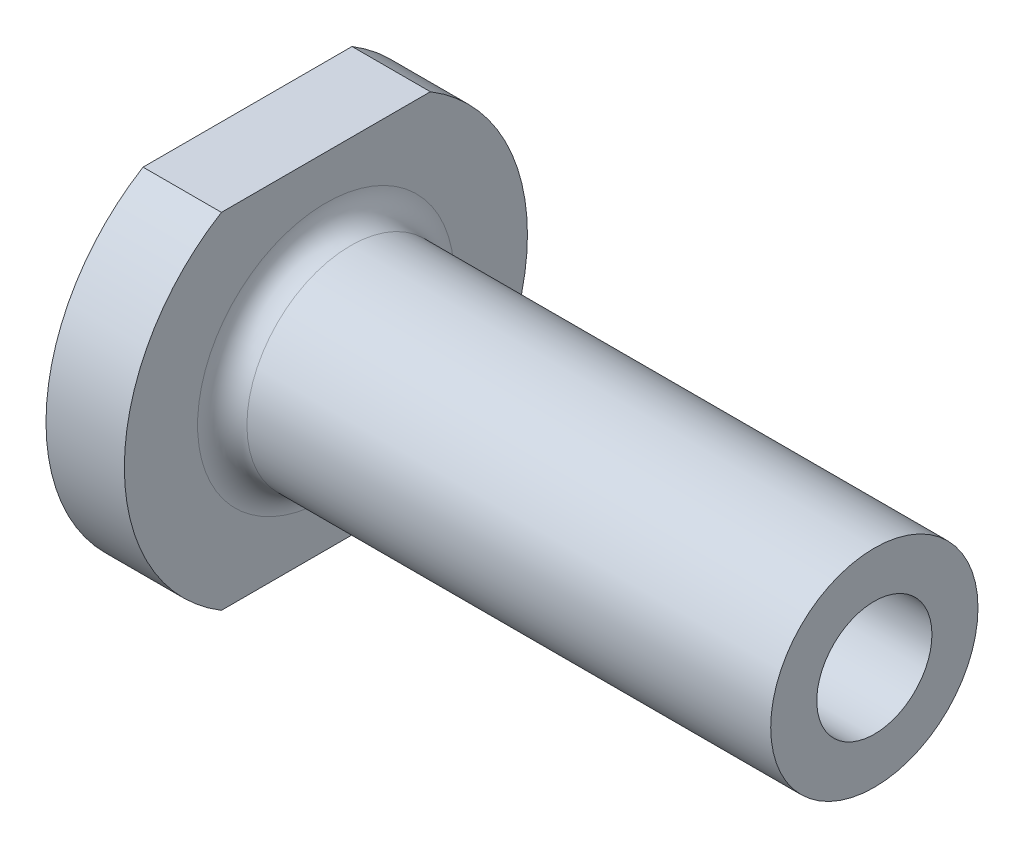
ISO-10303-21;
HEADER;
FILE_DESCRIPTION(('STEP AP214'),'2;1');
FILE_NAME('part.step','',(''),(''),'','','');
FILE_SCHEMA(('AUTOMOTIVE_DESIGN { 1 0 10303 214 1 1 1 1 }'));
ENDSEC;
DATA;
#1=APPLICATION_CONTEXT('core data for automotive mechanical design processes');
#2=APPLICATION_PROTOCOL_DEFINITION('international standard','automotive_design',2000,#1);
#3=PRODUCT_CONTEXT('',#1,'mechanical');
#4=PRODUCT('Part','Part','',(#3));
#5=PRODUCT_RELATED_PRODUCT_CATEGORY('part','',(#4));
#6=PRODUCT_DEFINITION_FORMATION('','',#4);
#7=PRODUCT_DEFINITION_CONTEXT('part definition',#1,'design');
#8=PRODUCT_DEFINITION('design','',#6,#7);
#9=PRODUCT_DEFINITION_SHAPE('','',#8);
#10=(LENGTH_UNIT() NAMED_UNIT(*) SI_UNIT(.MILLI.,.METRE.));
#11=(NAMED_UNIT(*) PLANE_ANGLE_UNIT() SI_UNIT($,.RADIAN.));
#12=(NAMED_UNIT(*) SI_UNIT($,.STERADIAN.) SOLID_ANGLE_UNIT());
#13=UNCERTAINTY_MEASURE_WITH_UNIT(LENGTH_MEASURE(1.E-05),#10,'distance_accuracy_value','');
#14=(GEOMETRIC_REPRESENTATION_CONTEXT(3) GLOBAL_UNCERTAINTY_ASSIGNED_CONTEXT((#13)) GLOBAL_UNIT_ASSIGNED_CONTEXT((#10,
#11,#12)) REPRESENTATION_CONTEXT('',''));
#15=CARTESIAN_POINT('',(0.,0.,0.));
#16=DIRECTION('',(0.,0.,1.));
#17=DIRECTION('',(1.,0.,0.));
#18=AXIS2_PLACEMENT_3D('',#15,#16,#17);
#19=CARTESIAN_POINT('',(0.,0.,0.));
#20=DIRECTION('',(1.,0.,0.));
#21=DIRECTION('',(0.,0.,-1.));
#22=AXIS2_PLACEMENT_3D('',#19,#20,#21);
#23=CYLINDRICAL_SURFACE('',#22,12.250000011);
#24=DIRECTION('',(1.,0.,0.));
#25=VECTOR('',#24,1.);
#26=CARTESIAN_POINT('',(0.,10.4756861479094,-6.35));
#27=LINE('',#26,#25);
#28=CARTESIAN_POINT('',(4.76250000000002,10.4756861479094,-6.35));
#29=VERTEX_POINT('',#28);
#30=CARTESIAN_POINT('',(0.,10.4756861479094,-6.35));
#31=VERTEX_POINT('',#30);
#32=EDGE_CURVE('E11',#29,#31,#27,.F.);
#33=ORIENTED_EDGE('',*,*,#32,.F.);
#34=CARTESIAN_POINT('',(4.7625,0.,0.));
#35=DIRECTION('',(1.,0.,0.));
#36=DIRECTION('',(0.,0.,-1.));
#37=AXIS2_PLACEMENT_3D('',#34,#35,#36);
#38=CIRCLE('',#37,12.250000011);
#39=CARTESIAN_POINT('',(4.76250000000002,-10.4756861479094,-6.35));
#40=VERTEX_POINT('',#39);
#41=EDGE_CURVE('E118',#40,#29,#38,.T.);
#42=ORIENTED_EDGE('',*,*,#41,.F.);
#43=DIRECTION('',(1.,0.,0.));
#44=VECTOR('',#43,1.);
#45=CARTESIAN_POINT('',(0.,-10.4756861479094,-6.35));
#46=LINE('',#45,#44);
#47=CARTESIAN_POINT('',(0.,-10.4756861479094,-6.35));
#48=VERTEX_POINT('',#47);
#49=EDGE_CURVE('E110',#48,#40,#46,.T.);
#50=ORIENTED_EDGE('',*,*,#49,.F.);
#51=CARTESIAN_POINT('',(0.,0.,0.));
#52=DIRECTION('',(1.,0.,0.));
#53=DIRECTION('',(0.,0.,-1.));
#54=AXIS2_PLACEMENT_3D('',#51,#52,#53);
#55=CIRCLE('',#54,12.250000011);
#56=EDGE_CURVE('E104',#48,#31,#55,.T.);
#57=ORIENTED_EDGE('',*,*,#56,.T.);
#58=EDGE_LOOP('',(#33,#42,#50,#57));
#59=FACE_BOUND('',#58,.T.);
#60=ADVANCED_FACE('F53',(#59),#23,.T.);
#61=CARTESIAN_POINT('',(0.,12.250000011,0.));
#62=DIRECTION('',(-1.,0.,0.));
#63=DIRECTION('',(0.,0.,1.));
#64=AXIS2_PLACEMENT_3D('',#61,#62,#63);
#65=PLANE('',#64);
#66=DIRECTION('',(0.,0.,1.));
#67=VECTOR('',#66,1.);
#68=CARTESIAN_POINT('',(0.,10.4756861479094,-6.35));
#69=LINE('',#68,#67);
#70=CARTESIAN_POINT('',(0.,10.4756861479094,6.35));
#71=VERTEX_POINT('',#70);
#72=EDGE_CURVE('E76',#31,#71,#69,.T.);
#73=ORIENTED_EDGE('',*,*,#72,.F.);
#74=ORIENTED_EDGE('',*,*,#56,.F.);
#75=DIRECTION('',(0.,0.,-1.));
#76=VECTOR('',#75,1.);
#77=CARTESIAN_POINT('',(0.,-10.4756861479094,6.35));
#78=LINE('',#77,#76);
#79=CARTESIAN_POINT('',(0.,-10.4756861479094,6.35));
#80=VERTEX_POINT('',#79);
#81=EDGE_CURVE('E69',#80,#48,#78,.T.);
#82=ORIENTED_EDGE('',*,*,#81,.F.);
#83=EDGE_CURVE('E106',#71,#80,#55,.T.);
#84=ORIENTED_EDGE('',*,*,#83,.F.);
#85=EDGE_LOOP('',(#73,#74,#82,#84));
#86=FACE_BOUND('',#85,.T.);
#87=CARTESIAN_POINT('',(0.,0.,0.));
#88=DIRECTION('',(1.,0.,0.));
#89=DIRECTION('',(0.,0.,-1.));
#90=AXIS2_PLACEMENT_3D('',#87,#88,#89);
#91=CIRCLE('',#90,3.49999999999999);
#92=CARTESIAN_POINT('',(0.,0.,-3.49999999999999));
#93=VERTEX_POINT('',#92);
#94=EDGE_CURVE('E112',#93,#93,#91,.T.);
#95=ORIENTED_EDGE('',*,*,#94,.T.);
#96=EDGE_LOOP('',(#95));
#97=FACE_BOUND('',#96,.T.);
#98=ADVANCED_FACE('F102',(#86,#97),#65,.T.);
#99=CARTESIAN_POINT('',(38.1,0.,0.));
#100=DIRECTION('',(1.,0.,0.));
#101=DIRECTION('',(0.,0.,-1.));
#102=AXIS2_PLACEMENT_3D('',#99,#100,#101);
#103=PLANE('',#102);
#104=CARTESIAN_POINT('',(38.1,0.,0.));
#105=DIRECTION('',(1.,0.,0.));
#106=DIRECTION('',(0.,0.,-1.));
#107=AXIS2_PLACEMENT_3D('',#104,#105,#106);
#108=CIRCLE('',#107,3.5);
#109=CARTESIAN_POINT('',(38.1,0.,-3.5));
#110=VERTEX_POINT('',#109);
#111=EDGE_CURVE('E120',#110,#110,#108,.T.);
#112=ORIENTED_EDGE('',*,*,#111,.F.);
#113=EDGE_LOOP('',(#112));
#114=FACE_BOUND('',#113,.T.);
#115=CARTESIAN_POINT('',(38.1,0.,0.));
#116=DIRECTION('',(1.,0.,0.));
#117=DIRECTION('',(0.,0.,-1.));
#118=AXIS2_PLACEMENT_3D('',#115,#116,#117);
#119=CIRCLE('',#118,6.299999973);
#120=CARTESIAN_POINT('',(38.1,0.,-6.299999973));
#121=VERTEX_POINT('',#120);
#122=EDGE_CURVE('E127',#121,#121,#119,.T.);
#123=ORIENTED_EDGE('',*,*,#122,.T.);
#124=EDGE_LOOP('',(#123));
#125=FACE_BOUND('',#124,.T.);
#126=ADVANCED_FACE('F209',(#114,#125),#103,.T.);
#127=CARTESIAN_POINT('',(0.,0.,0.));
#128=DIRECTION('',(1.,0.,0.));
#129=DIRECTION('',(0.,0.,-1.));
#130=AXIS2_PLACEMENT_3D('',#127,#128,#129);
#131=CYLINDRICAL_SURFACE('',#130,6.299999973);
#132=CARTESIAN_POINT('',(6.2625,0.,0.));
#133=DIRECTION('',(1.,0.,0.));
#134=DIRECTION('',(0.,0.,-1.));
#135=AXIS2_PLACEMENT_3D('',#132,#133,#134);
#136=CIRCLE('',#135,6.299999973);
#137=CARTESIAN_POINT('',(6.2625,0.,-6.299999973));
#138=VERTEX_POINT('',#137);
#139=EDGE_CURVE('E131',#138,#138,#136,.T.);
#140=ORIENTED_EDGE('',*,*,#139,.T.);
#141=EDGE_LOOP('',(#140));
#142=FACE_BOUND('',#141,.T.);
#143=ORIENTED_EDGE('',*,*,#122,.F.);
#144=EDGE_LOOP('',(#143));
#145=FACE_BOUND('',#144,.T.);
#146=ADVANCED_FACE('F216',(#142,#145),#131,.T.);
#147=CARTESIAN_POINT('',(4.7625,6.299999973,0.));
#148=DIRECTION('',(1.,0.,0.));
#149=DIRECTION('',(0.,0.,-1.));
#150=AXIS2_PLACEMENT_3D('',#147,#148,#149);
#151=PLANE('',#150);
#152=DIRECTION('',(0.,0.,-1.));
#153=VECTOR('',#152,1.);
#154=CARTESIAN_POINT('',(4.7625,10.4756861479094,0.));
#155=LINE('',#154,#153);
#156=CARTESIAN_POINT('',(4.76250000000002,10.4756861479094,6.35));
#157=VERTEX_POINT('',#156);
#158=EDGE_CURVE('E94',#157,#29,#155,.T.);
#159=ORIENTED_EDGE('',*,*,#158,.F.);
#160=CARTESIAN_POINT('',(4.76250000000002,-10.4756861479094,6.35));
#161=VERTEX_POINT('',#160);
#162=EDGE_CURVE('E126',#157,#161,#38,.T.);
#163=ORIENTED_EDGE('',*,*,#162,.T.);
#164=DIRECTION('',(0.,0.,1.));
#165=VECTOR('',#164,1.);
#166=CARTESIAN_POINT('',(4.7625,-10.4756861479094,0.));
#167=LINE('',#166,#165);
#168=EDGE_CURVE('E108',#40,#161,#167,.T.);
#169=ORIENTED_EDGE('',*,*,#168,.F.);
#170=ORIENTED_EDGE('',*,*,#41,.T.);
#171=EDGE_LOOP('',(#159,#163,#169,#170));
#172=FACE_BOUND('',#171,.T.);
#173=CARTESIAN_POINT('',(4.7625,0.,0.));
#174=DIRECTION('',(1.,0.,0.));
#175=DIRECTION('',(0.,0.,-1.));
#176=AXIS2_PLACEMENT_3D('',#173,#174,#175);
#177=CIRCLE('',#176,7.799999973);
#178=CARTESIAN_POINT('',(4.7625,0.,-7.799999973));
#179=VERTEX_POINT('',#178);
#180=EDGE_CURVE('E135',#179,#179,#177,.F.);
#181=ORIENTED_EDGE('',*,*,#180,.T.);
#182=EDGE_LOOP('',(#181));
#183=FACE_BOUND('',#182,.T.);
#184=ADVANCED_FACE('F150',(#172,#183),#151,.T.);
#185=DIRECTION('',(1.,0.,0.));
#186=VECTOR('',#185,1.);
#187=CARTESIAN_POINT('',(0.,10.4756861479094,6.35));
#188=LINE('',#187,#186);
#189=EDGE_CURVE('E62',#71,#157,#188,.T.);
#190=ORIENTED_EDGE('',*,*,#189,.F.);
#191=ORIENTED_EDGE('',*,*,#83,.T.);
#192=DIRECTION('',(1.,0.,0.));
#193=VECTOR('',#192,1.);
#194=CARTESIAN_POINT('',(0.,-10.4756861479094,6.35));
#195=LINE('',#194,#193);
#196=EDGE_CURVE('E141',#161,#80,#195,.F.);
#197=ORIENTED_EDGE('',*,*,#196,.F.);
#198=ORIENTED_EDGE('',*,*,#162,.F.);
#199=EDGE_LOOP('',(#190,#191,#197,#198));
#200=FACE_BOUND('',#199,.T.);
#201=ADVANCED_FACE('F156',(#200),#23,.T.);
#202=CARTESIAN_POINT('',(6.2625,0.,0.));
#203=DIRECTION('',(1.,0.,0.));
#204=DIRECTION('',(0.,0.,-1.));
#205=AXIS2_PLACEMENT_3D('',#202,#203,#204);
#206=TOROIDAL_SURFACE('',#205,7.799999973,1.5);
#207=ORIENTED_EDGE('',*,*,#180,.F.);
#208=EDGE_LOOP('',(#207));
#209=FACE_BOUND('',#208,.T.);
#210=ORIENTED_EDGE('',*,*,#139,.F.);
#211=EDGE_LOOP('',(#210));
#212=FACE_BOUND('',#211,.T.);
#213=ADVANCED_FACE('F55',(#209,#212),#206,.F.);
#214=CARTESIAN_POINT('',(38.1,0.,0.));
#215=DIRECTION('',(1.,0.,0.));
#216=DIRECTION('',(0.,0.,-1.));
#217=AXIS2_PLACEMENT_3D('',#214,#215,#216);
#218=CYLINDRICAL_SURFACE('',#217,3.49999999999999);
#219=ORIENTED_EDGE('',*,*,#94,.F.);
#220=EDGE_LOOP('',(#219));
#221=FACE_BOUND('',#220,.T.);
#222=ORIENTED_EDGE('',*,*,#111,.T.);
#223=EDGE_LOOP('',(#222));
#224=FACE_BOUND('',#223,.T.);
#225=ADVANCED_FACE('F196',(#221,#224),#218,.F.);
#226=CARTESIAN_POINT('',(38.1,-10.4756861479094,6.35));
#227=DIRECTION('',(0.,1.,0.));
#228=DIRECTION('',(0.,0.,1.));
#229=AXIS2_PLACEMENT_3D('',#226,#227,#228);
#230=PLANE('',#229);
#231=ORIENTED_EDGE('',*,*,#168,.T.);
#232=ORIENTED_EDGE('',*,*,#196,.T.);
#233=ORIENTED_EDGE('',*,*,#81,.T.);
#234=ORIENTED_EDGE('',*,*,#49,.T.);
#235=EDGE_LOOP('',(#231,#232,#233,#234));
#236=FACE_BOUND('',#235,.T.);
#237=ADVANCED_FACE('F194',(#236),#230,.F.);
#238=CARTESIAN_POINT('',(38.1,10.4756861479094,-6.35));
#239=DIRECTION('',(0.,-1.,0.));
#240=DIRECTION('',(0.,0.,-1.));
#241=AXIS2_PLACEMENT_3D('',#238,#239,#240);
#242=PLANE('',#241);
#243=ORIENTED_EDGE('',*,*,#158,.T.);
#244=ORIENTED_EDGE('',*,*,#32,.T.);
#245=ORIENTED_EDGE('',*,*,#72,.T.);
#246=ORIENTED_EDGE('',*,*,#189,.T.);
#247=EDGE_LOOP('',(#243,#244,#245,#246));
#248=FACE_BOUND('',#247,.T.);
#249=ADVANCED_FACE('F92',(#248),#242,.F.);
#250=CLOSED_SHELL('',(#60,#98,#126,#146,#184,#201,#213,#225,#237,#249));
#251=MANIFOLD_SOLID_BREP('B2',#250);
#252=ADVANCED_BREP_SHAPE_REPRESENTATION('',(#18,#251),#14);
#253=SHAPE_DEFINITION_REPRESENTATION(#9,#252);
ENDSEC;
END-ISO-10303-21;
